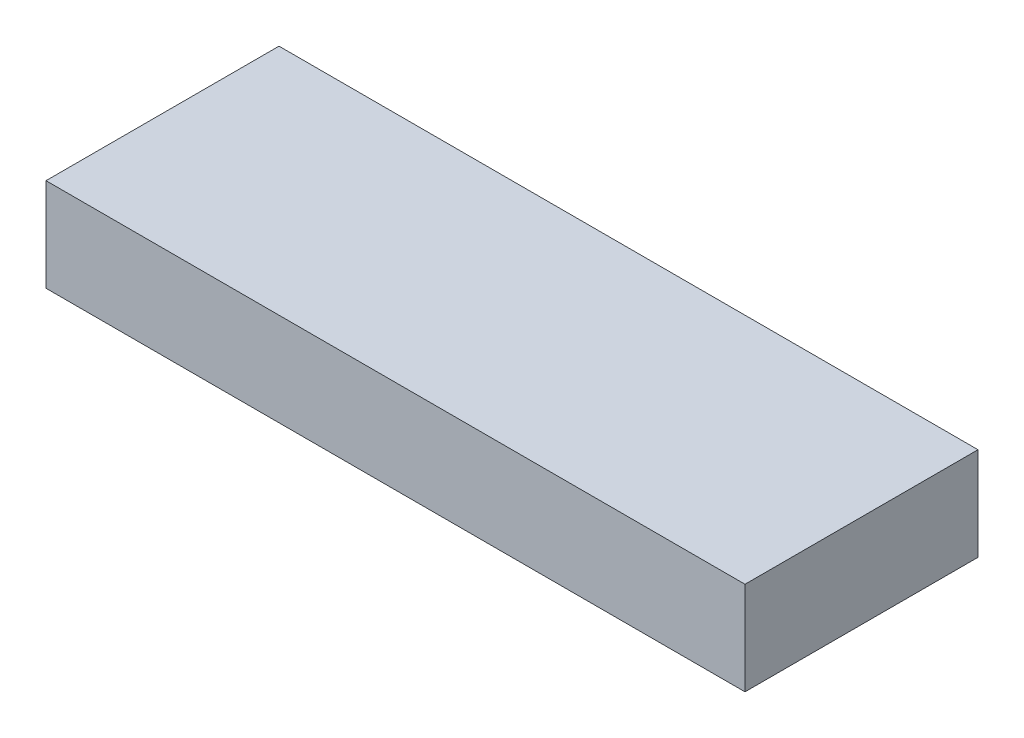
ISO-10303-21;
HEADER;
FILE_DESCRIPTION(('STEP AP214'),'2;1');
FILE_NAME('part.step','',(''),(''),'','','');
FILE_SCHEMA(('AUTOMOTIVE_DESIGN { 1 0 10303 214 1 1 1 1 }'));
ENDSEC;
DATA;
#1=APPLICATION_CONTEXT('core data for automotive mechanical design processes');
#2=APPLICATION_PROTOCOL_DEFINITION('international standard','automotive_design',2000,#1);
#3=PRODUCT_CONTEXT('',#1,'mechanical');
#4=PRODUCT('Part','Part','',(#3));
#5=PRODUCT_RELATED_PRODUCT_CATEGORY('part','',(#4));
#6=PRODUCT_DEFINITION_FORMATION('','',#4);
#7=PRODUCT_DEFINITION_CONTEXT('part definition',#1,'design');
#8=PRODUCT_DEFINITION('design','',#6,#7);
#9=PRODUCT_DEFINITION_SHAPE('','',#8);
#10=(LENGTH_UNIT() NAMED_UNIT(*) SI_UNIT(.MILLI.,.METRE.));
#11=(NAMED_UNIT(*) PLANE_ANGLE_UNIT() SI_UNIT($,.RADIAN.));
#12=(NAMED_UNIT(*) SI_UNIT($,.STERADIAN.) SOLID_ANGLE_UNIT());
#13=UNCERTAINTY_MEASURE_WITH_UNIT(LENGTH_MEASURE(1.E-05),#10,'distance_accuracy_value','');
#14=(GEOMETRIC_REPRESENTATION_CONTEXT(3) GLOBAL_UNCERTAINTY_ASSIGNED_CONTEXT((#13)) GLOBAL_UNIT_ASSIGNED_CONTEXT((#10,
#11,#12)) REPRESENTATION_CONTEXT('',''));
#15=CARTESIAN_POINT('',(0.,0.,0.));
#16=DIRECTION('',(0.,0.,1.));
#17=DIRECTION('',(1.,0.,0.));
#18=AXIS2_PLACEMENT_3D('',#15,#16,#17);
#19=CARTESIAN_POINT('',(30.,9.99999999999998,50.));
#20=DIRECTION('',(1.,0.,0.));
#21=DIRECTION('',(0.,0.,-1.));
#22=AXIS2_PLACEMENT_3D('',#19,#20,#21);
#23=PLANE('',#22);
#24=DIRECTION('',(0.,-1.,0.));
#25=VECTOR('',#24,1.);
#26=CARTESIAN_POINT('',(30.,9.99999999999998,0.));
#27=LINE('',#26,#25);
#28=CARTESIAN_POINT('',(30.,9.99999999999998,0.));
#29=VERTEX_POINT('',#28);
#30=CARTESIAN_POINT('',(30.,-9.99999999999998,0.));
#31=VERTEX_POINT('',#30);
#32=EDGE_CURVE('E102',#29,#31,#27,.T.);
#33=ORIENTED_EDGE('',*,*,#32,.T.);
#34=DIRECTION('',(0.,0.,-1.));
#35=VECTOR('',#34,1.);
#36=CARTESIAN_POINT('',(30.,-9.99999999999998,50.));
#37=LINE('',#36,#35);
#38=CARTESIAN_POINT('',(30.,-9.99999999999998,50.));
#39=VERTEX_POINT('',#38);
#40=EDGE_CURVE('E11',#39,#31,#37,.T.);
#41=ORIENTED_EDGE('',*,*,#40,.F.);
#42=DIRECTION('',(0.,-1.,0.));
#43=VECTOR('',#42,1.);
#44=CARTESIAN_POINT('',(30.,9.99999999999998,50.));
#45=LINE('',#44,#43);
#46=CARTESIAN_POINT('',(30.,9.99999999999998,50.));
#47=VERTEX_POINT('',#46);
#48=EDGE_CURVE('E90',#47,#39,#45,.T.);
#49=ORIENTED_EDGE('',*,*,#48,.F.);
#50=DIRECTION('',(0.,0.,-1.));
#51=VECTOR('',#50,1.);
#52=CARTESIAN_POINT('',(30.,9.99999999999998,50.));
#53=LINE('',#52,#51);
#54=EDGE_CURVE('E98',#47,#29,#53,.T.);
#55=ORIENTED_EDGE('',*,*,#54,.T.);
#56=EDGE_LOOP('',(#33,#41,#49,#55));
#57=FACE_BOUND('',#56,.T.);
#58=ADVANCED_FACE('F39',(#57),#23,.F.);
#59=CARTESIAN_POINT('',(30.,-9.99999999999998,50.));
#60=DIRECTION('',(0.,1.,0.));
#61=DIRECTION('',(-1.,0.,0.));
#62=AXIS2_PLACEMENT_3D('',#59,#60,#61);
#63=PLANE('',#62);
#64=DIRECTION('',(1.,0.,0.));
#65=VECTOR('',#64,1.);
#66=CARTESIAN_POINT('',(30.,-9.99999999999998,0.));
#67=LINE('',#66,#65);
#68=CARTESIAN_POINT('',(180.,-10.,0.));
#69=VERTEX_POINT('',#68);
#70=EDGE_CURVE('E94',#31,#69,#67,.T.);
#71=ORIENTED_EDGE('',*,*,#70,.T.);
#72=DIRECTION('',(0.,0.,-1.));
#73=VECTOR('',#72,1.);
#74=CARTESIAN_POINT('',(180.,-10.,50.));
#75=LINE('',#74,#73);
#76=CARTESIAN_POINT('',(180.,-10.,50.));
#77=VERTEX_POINT('',#76);
#78=EDGE_CURVE('E47',#77,#69,#75,.T.);
#79=ORIENTED_EDGE('',*,*,#78,.F.);
#80=DIRECTION('',(1.,0.,0.));
#81=VECTOR('',#80,1.);
#82=CARTESIAN_POINT('',(30.,-9.99999999999998,50.));
#83=LINE('',#82,#81);
#84=EDGE_CURVE('E85',#39,#77,#83,.T.);
#85=ORIENTED_EDGE('',*,*,#84,.F.);
#86=ORIENTED_EDGE('',*,*,#40,.T.);
#87=EDGE_LOOP('',(#71,#79,#85,#86));
#88=FACE_BOUND('',#87,.T.);
#89=ADVANCED_FACE('F93',(#88),#63,.F.);
#90=CARTESIAN_POINT('',(180.,-10.,50.));
#91=DIRECTION('',(-1.,0.,0.));
#92=DIRECTION('',(0.,0.,1.));
#93=AXIS2_PLACEMENT_3D('',#90,#91,#92);
#94=PLANE('',#93);
#95=DIRECTION('',(0.,1.,0.));
#96=VECTOR('',#95,1.);
#97=CARTESIAN_POINT('',(180.,-10.,0.));
#98=LINE('',#97,#96);
#99=CARTESIAN_POINT('',(180.,10.,0.));
#100=VERTEX_POINT('',#99);
#101=EDGE_CURVE('E72',#69,#100,#98,.T.);
#102=ORIENTED_EDGE('',*,*,#101,.T.);
#103=DIRECTION('',(0.,0.,-1.));
#104=VECTOR('',#103,1.);
#105=CARTESIAN_POINT('',(180.,10.,50.));
#106=LINE('',#105,#104);
#107=CARTESIAN_POINT('',(180.,10.,50.));
#108=VERTEX_POINT('',#107);
#109=EDGE_CURVE('E95',#108,#100,#106,.T.);
#110=ORIENTED_EDGE('',*,*,#109,.F.);
#111=DIRECTION('',(0.,1.,0.));
#112=VECTOR('',#111,1.);
#113=CARTESIAN_POINT('',(180.,-10.,50.));
#114=LINE('',#113,#112);
#115=EDGE_CURVE('E88',#77,#108,#114,.T.);
#116=ORIENTED_EDGE('',*,*,#115,.F.);
#117=ORIENTED_EDGE('',*,*,#78,.T.);
#118=EDGE_LOOP('',(#102,#110,#116,#117));
#119=FACE_BOUND('',#118,.T.);
#120=ADVANCED_FACE('F96',(#119),#94,.F.);
#121=CARTESIAN_POINT('',(180.,10.,50.));
#122=DIRECTION('',(0.,-1.,0.));
#123=DIRECTION('',(1.,0.,0.));
#124=AXIS2_PLACEMENT_3D('',#121,#122,#123);
#125=PLANE('',#124);
#126=DIRECTION('',(-1.,0.,0.));
#127=VECTOR('',#126,1.);
#128=CARTESIAN_POINT('',(180.,10.,0.));
#129=LINE('',#128,#127);
#130=EDGE_CURVE('E78',#100,#29,#129,.T.);
#131=ORIENTED_EDGE('',*,*,#130,.T.);
#132=ORIENTED_EDGE('',*,*,#54,.F.);
#133=DIRECTION('',(-1.,0.,0.));
#134=VECTOR('',#133,1.);
#135=CARTESIAN_POINT('',(180.,10.,50.));
#136=LINE('',#135,#134);
#137=EDGE_CURVE('E55',#108,#47,#136,.T.);
#138=ORIENTED_EDGE('',*,*,#137,.F.);
#139=ORIENTED_EDGE('',*,*,#109,.T.);
#140=EDGE_LOOP('',(#131,#132,#138,#139));
#141=FACE_BOUND('',#140,.T.);
#142=ADVANCED_FACE('F109',(#141),#125,.F.);
#143=CARTESIAN_POINT('',(0.,0.,50.));
#144=DIRECTION('',(0.,0.,1.));
#145=DIRECTION('',(1.,0.,0.));
#146=AXIS2_PLACEMENT_3D('',#143,#144,#145);
#147=PLANE('',#146);
#148=ORIENTED_EDGE('',*,*,#48,.T.);
#149=ORIENTED_EDGE('',*,*,#84,.T.);
#150=ORIENTED_EDGE('',*,*,#115,.T.);
#151=ORIENTED_EDGE('',*,*,#137,.T.);
#152=EDGE_LOOP('',(#148,#149,#150,#151));
#153=FACE_BOUND('',#152,.T.);
#154=ADVANCED_FACE('F86',(#153),#147,.T.);
#155=CARTESIAN_POINT('',(0.,0.,0.));
#156=DIRECTION('',(0.,0.,1.));
#157=DIRECTION('',(1.,0.,0.));
#158=AXIS2_PLACEMENT_3D('',#155,#156,#157);
#159=PLANE('',#158);
#160=ORIENTED_EDGE('',*,*,#32,.F.);
#161=ORIENTED_EDGE('',*,*,#130,.F.);
#162=ORIENTED_EDGE('',*,*,#101,.F.);
#163=ORIENTED_EDGE('',*,*,#70,.F.);
#164=EDGE_LOOP('',(#160,#161,#162,#163));
#165=FACE_BOUND('',#164,.T.);
#166=ADVANCED_FACE('F112',(#165),#159,.F.);
#167=CLOSED_SHELL('',(#58,#89,#120,#142,#154,#166));
#168=MANIFOLD_SOLID_BREP('B2',#167);
#169=ADVANCED_BREP_SHAPE_REPRESENTATION('',(#18,#168),#14);
#170=SHAPE_DEFINITION_REPRESENTATION(#9,#169);
ENDSEC;
END-ISO-10303-21;
